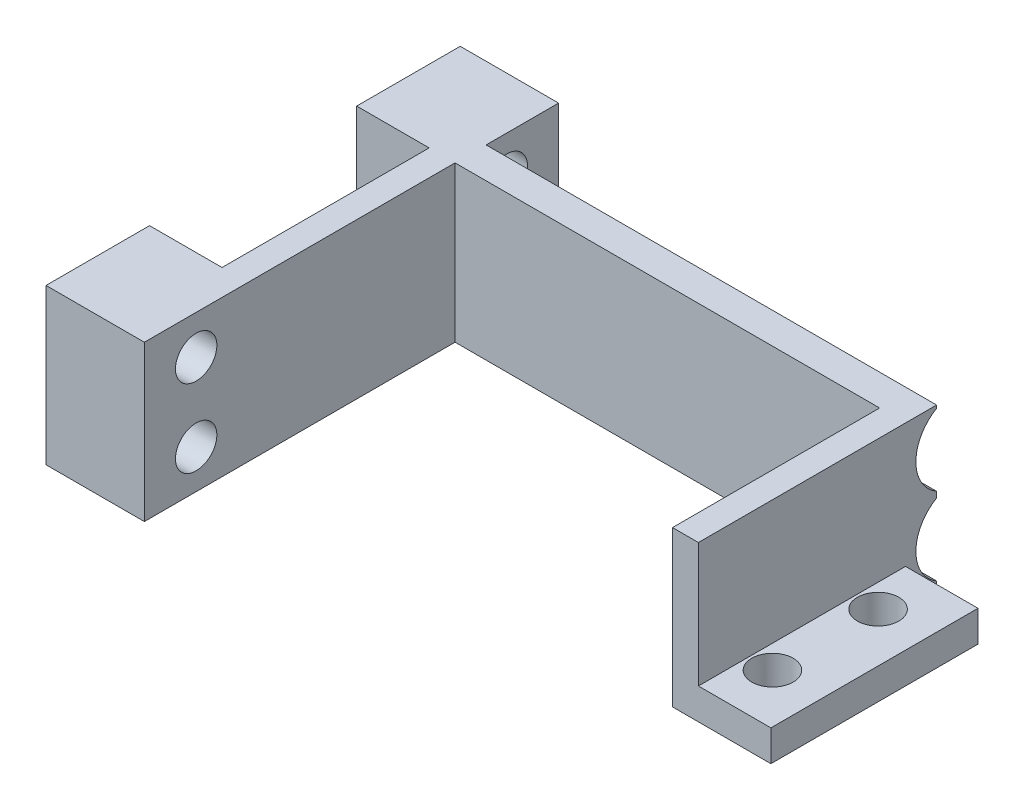
ISO-10303-21;
HEADER;
FILE_DESCRIPTION(('STEP AP214'),'2;1');
FILE_NAME('part.step','',(''),(''),'','','');
FILE_SCHEMA(('AUTOMOTIVE_DESIGN { 1 0 10303 214 1 1 1 1 }'));
ENDSEC;
DATA;
#1=APPLICATION_CONTEXT('core data for automotive mechanical design processes');
#2=APPLICATION_PROTOCOL_DEFINITION('international standard','automotive_design',2000,#1);
#3=PRODUCT_CONTEXT('',#1,'mechanical');
#4=PRODUCT('Part','Part','',(#3));
#5=PRODUCT_RELATED_PRODUCT_CATEGORY('part','',(#4));
#6=PRODUCT_DEFINITION_FORMATION('','',#4);
#7=PRODUCT_DEFINITION_CONTEXT('part definition',#1,'design');
#8=PRODUCT_DEFINITION('design','',#6,#7);
#9=PRODUCT_DEFINITION_SHAPE('','',#8);
#10=(LENGTH_UNIT() NAMED_UNIT(*) SI_UNIT(.MILLI.,.METRE.));
#11=(NAMED_UNIT(*) PLANE_ANGLE_UNIT() SI_UNIT($,.RADIAN.));
#12=(NAMED_UNIT(*) SI_UNIT($,.STERADIAN.) SOLID_ANGLE_UNIT());
#13=UNCERTAINTY_MEASURE_WITH_UNIT(LENGTH_MEASURE(1.E-05),#10,'distance_accuracy_value','');
#14=(GEOMETRIC_REPRESENTATION_CONTEXT(3) GLOBAL_UNCERTAINTY_ASSIGNED_CONTEXT((#13)) GLOBAL_UNIT_ASSIGNED_CONTEXT((#10,
#11,#12)) REPRESENTATION_CONTEXT('',''));
#15=CARTESIAN_POINT('',(0.,0.,0.));
#16=DIRECTION('',(0.,0.,1.));
#17=DIRECTION('',(1.,0.,0.));
#18=AXIS2_PLACEMENT_3D('',#15,#16,#17);
#19=CARTESIAN_POINT('',(0.,-20.,0.));
#20=DIRECTION('',(0.,0.,-1.));
#21=DIRECTION('',(-1.,0.,0.));
#22=AXIS2_PLACEMENT_3D('',#19,#20,#21);
#23=PLANE('',#22);
#24=DIRECTION('',(0.,1.,0.));
#25=VECTOR('',#24,1.);
#26=CARTESIAN_POINT('',(2.5,-20.,0.));
#27=LINE('',#26,#25);
#28=CARTESIAN_POINT('',(2.5,-27.7858983848622,0.));
#29=VERTEX_POINT('',#28);
#30=CARTESIAN_POINT('',(2.5,-27.2141016151378,0.));
#31=VERTEX_POINT('',#30);
#32=EDGE_CURVE('E48',#29,#31,#27,.T.);
#33=ORIENTED_EDGE('',*,*,#32,.T.);
#34=DIRECTION('',(-1.,0.,0.));
#35=VECTOR('',#34,1.);
#36=CARTESIAN_POINT('',(53.001,-27.2141016151378,0.));
#37=LINE('',#36,#35);
#38=CARTESIAN_POINT('',(46.,-27.2141016151378,0.));
#39=VERTEX_POINT('',#38);
#40=EDGE_CURVE('E192',#39,#31,#37,.T.);
#41=ORIENTED_EDGE('',*,*,#40,.F.);
#42=DIRECTION('',(0.,-1.,0.));
#43=VECTOR('',#42,1.);
#44=CARTESIAN_POINT('',(46.,-20.,0.));
#45=LINE('',#44,#43);
#46=CARTESIAN_POINT('',(46.,-27.7858983848622,0.));
#47=VERTEX_POINT('',#46);
#48=EDGE_CURVE('E372',#39,#47,#45,.T.);
#49=ORIENTED_EDGE('',*,*,#48,.T.);
#50=DIRECTION('',(-1.,0.,0.));
#51=VECTOR('',#50,1.);
#52=CARTESIAN_POINT('',(53.001,-27.7858983848622,0.));
#53=LINE('',#52,#51);
#54=EDGE_CURVE('E442',#29,#47,#53,.F.);
#55=ORIENTED_EDGE('',*,*,#54,.F.);
#56=EDGE_LOOP('',(#33,#41,#49,#55));
#57=FACE_BOUND('',#56,.T.);
#58=ADVANCED_FACE('F39',(#57),#23,.T.);
#59=CARTESIAN_POINT('',(46.,-20.,0.));
#60=VERTEX_POINT('',#59);
#61=CARTESIAN_POINT('',(46.,-20.2858983848622,0.));
#62=VERTEX_POINT('',#61);
#63=EDGE_CURVE('E204',#60,#62,#45,.T.);
#64=ORIENTED_EDGE('',*,*,#63,.T.);
#65=DIRECTION('',(-1.,0.,0.));
#66=VECTOR('',#65,1.);
#67=CARTESIAN_POINT('',(53.001,-20.2858983848622,0.));
#68=LINE('',#67,#66);
#69=CARTESIAN_POINT('',(2.5,-20.2858983848622,0.));
#70=VERTEX_POINT('',#69);
#71=EDGE_CURVE('E189',#70,#62,#68,.F.);
#72=ORIENTED_EDGE('',*,*,#71,.F.);
#73=CARTESIAN_POINT('',(2.5,-20.,0.));
#74=VERTEX_POINT('',#73);
#75=EDGE_CURVE('E50',#70,#74,#27,.T.);
#76=ORIENTED_EDGE('',*,*,#75,.T.);
#77=DIRECTION('',(1.,0.,0.));
#78=VECTOR('',#77,1.);
#79=CARTESIAN_POINT('',(0.,-20.,0.));
#80=LINE('',#79,#78);
#81=EDGE_CURVE('E360',#74,#60,#80,.T.);
#82=ORIENTED_EDGE('',*,*,#81,.T.);
#83=EDGE_LOOP('',(#64,#72,#76,#82));
#84=FACE_BOUND('',#83,.T.);
#85=ADVANCED_FACE('F201',(#84),#23,.T.);
#86=CARTESIAN_POINT('',(2.5,-35.,0.));
#87=VERTEX_POINT('',#86);
#88=CARTESIAN_POINT('',(2.5,-34.7141016151377,0.));
#89=VERTEX_POINT('',#88);
#90=EDGE_CURVE('E11',#87,#89,#27,.T.);
#91=ORIENTED_EDGE('',*,*,#90,.T.);
#92=DIRECTION('',(-1.,0.,0.));
#93=VECTOR('',#92,1.);
#94=CARTESIAN_POINT('',(53.001,-34.7141016151377,0.));
#95=LINE('',#94,#93);
#96=CARTESIAN_POINT('',(46.,-34.7141016151377,0.));
#97=VERTEX_POINT('',#96);
#98=EDGE_CURVE('E205',#97,#89,#95,.T.);
#99=ORIENTED_EDGE('',*,*,#98,.F.);
#100=CARTESIAN_POINT('',(46.,-35.,0.));
#101=VERTEX_POINT('',#100);
#102=EDGE_CURVE('E370',#97,#101,#45,.T.);
#103=ORIENTED_EDGE('',*,*,#102,.T.);
#104=DIRECTION('',(-1.,0.,0.));
#105=VECTOR('',#104,1.);
#106=CARTESIAN_POINT('',(0.,-35.,0.));
#107=LINE('',#106,#105);
#108=EDGE_CURVE('E365',#101,#87,#107,.T.);
#109=ORIENTED_EDGE('',*,*,#108,.T.);
#110=EDGE_LOOP('',(#91,#99,#103,#109));
#111=FACE_BOUND('',#110,.T.);
#112=ADVANCED_FACE('F434',(#111),#23,.T.);
#113=CARTESIAN_POINT('',(0.,-20.,3.));
#114=DIRECTION('',(1.,0.,0.));
#115=DIRECTION('',(0.,0.,-1.));
#116=AXIS2_PLACEMENT_3D('',#113,#114,#115);
#117=PLANE('',#116);
#118=DIRECTION('',(0.,0.,1.));
#119=VECTOR('',#118,1.);
#120=CARTESIAN_POINT('',(0.,-32.,23.));
#121=LINE('',#120,#119);
#122=CARTESIAN_POINT('',(0.,-32.,3.));
#123=VERTEX_POINT('',#122);
#124=CARTESIAN_POINT('',(0.,-32.,23.));
#125=VERTEX_POINT('',#124);
#126=EDGE_CURVE('E340',#123,#125,#121,.T.);
#127=ORIENTED_EDGE('',*,*,#126,.T.);
#128=DIRECTION('',(0.,1.,0.));
#129=VECTOR('',#128,1.);
#130=CARTESIAN_POINT('',(0.,-20.,23.));
#131=LINE('',#130,#129);
#132=CARTESIAN_POINT('',(0.,-20.,23.));
#133=VERTEX_POINT('',#132);
#134=EDGE_CURVE('E351',#125,#133,#131,.T.);
#135=ORIENTED_EDGE('',*,*,#134,.T.);
#136=DIRECTION('',(0.,0.,-1.));
#137=VECTOR('',#136,1.);
#138=CARTESIAN_POINT('',(0.,-20.,3.));
#139=LINE('',#138,#137);
#140=CARTESIAN_POINT('',(0.,-20.,3.));
#141=VERTEX_POINT('',#140);
#142=EDGE_CURVE('E211',#133,#141,#139,.T.);
#143=ORIENTED_EDGE('',*,*,#142,.T.);
#144=DIRECTION('',(0.,1.,0.));
#145=VECTOR('',#144,1.);
#146=CARTESIAN_POINT('',(0.,-20.,3.));
#147=LINE('',#146,#145);
#148=EDGE_CURVE('E256',#123,#141,#147,.T.);
#149=ORIENTED_EDGE('',*,*,#148,.F.);
#150=EDGE_LOOP('',(#127,#135,#143,#149));
#151=FACE_BOUND('',#150,.T.);
#152=ADVANCED_FACE('F41',(#151),#117,.F.);
#153=CARTESIAN_POINT('',(0.,-20.,3.));
#154=DIRECTION('',(0.,0.,-1.));
#155=DIRECTION('',(-1.,0.,0.));
#156=AXIS2_PLACEMENT_3D('',#153,#154,#155);
#157=PLANE('',#156);
#158=DIRECTION('',(1.,0.,0.));
#159=VECTOR('',#158,1.);
#160=CARTESIAN_POINT('',(0.,-20.,3.));
#161=LINE('',#160,#159);
#162=CARTESIAN_POINT('',(2.5,-20.,3.));
#163=VERTEX_POINT('',#162);
#164=CARTESIAN_POINT('',(43.5,-20.,3.));
#165=VERTEX_POINT('',#164);
#166=EDGE_CURVE('E361',#163,#165,#161,.T.);
#167=ORIENTED_EDGE('',*,*,#166,.F.);
#168=DIRECTION('',(0.,-1.,0.));
#169=VECTOR('',#168,1.);
#170=CARTESIAN_POINT('',(2.5,-20.,3.));
#171=LINE('',#170,#169);
#172=CARTESIAN_POINT('',(2.5,-35.,3.));
#173=VERTEX_POINT('',#172);
#174=EDGE_CURVE('E350',#163,#173,#171,.T.);
#175=ORIENTED_EDGE('',*,*,#174,.T.);
#176=DIRECTION('',(-1.,0.,0.));
#177=VECTOR('',#176,1.);
#178=CARTESIAN_POINT('',(0.,-35.,3.));
#179=LINE('',#178,#177);
#180=CARTESIAN_POINT('',(43.5,-35.,3.));
#181=VERTEX_POINT('',#180);
#182=EDGE_CURVE('E364',#181,#173,#179,.T.);
#183=ORIENTED_EDGE('',*,*,#182,.F.);
#184=DIRECTION('',(0.,-1.,0.));
#185=VECTOR('',#184,1.);
#186=CARTESIAN_POINT('',(43.5,-20.,3.));
#187=LINE('',#186,#185);
#188=EDGE_CURVE('E314',#165,#181,#187,.T.);
#189=ORIENTED_EDGE('',*,*,#188,.F.);
#190=EDGE_LOOP('',(#167,#175,#183,#189));
#191=FACE_BOUND('',#190,.T.);
#192=ADVANCED_FACE('F415',(#191),#157,.F.);
#193=CARTESIAN_POINT('',(0.,-20.,3.));
#194=DIRECTION('',(0.,-1.,0.));
#195=DIRECTION('',(0.,0.,1.));
#196=AXIS2_PLACEMENT_3D('',#193,#194,#195);
#197=PLANE('',#196);
#198=ORIENTED_EDGE('',*,*,#142,.F.);
#199=DIRECTION('',(1.,0.,0.));
#200=VECTOR('',#199,1.);
#201=CARTESIAN_POINT('',(2.5,-20.,23.));
#202=LINE('',#201,#200);
#203=CARTESIAN_POINT('',(-7.00000000000001,-20.,23.));
#204=VERTEX_POINT('',#203);
#205=EDGE_CURVE('E275',#204,#133,#202,.T.);
#206=ORIENTED_EDGE('',*,*,#205,.F.);
#207=DIRECTION('',(0.,0.,-1.));
#208=VECTOR('',#207,1.);
#209=CARTESIAN_POINT('',(-7.00000000000001,-20.,33.));
#210=LINE('',#209,#208);
#211=CARTESIAN_POINT('',(-7.00000000000001,-20.,33.));
#212=VERTEX_POINT('',#211);
#213=EDGE_CURVE('E283',#212,#204,#210,.T.);
#214=ORIENTED_EDGE('',*,*,#213,.F.);
#215=DIRECTION('',(1.,0.,0.));
#216=VECTOR('',#215,1.);
#217=CARTESIAN_POINT('',(2.5,-20.,33.));
#218=LINE('',#217,#216);
#219=CARTESIAN_POINT('',(2.5,-20.,33.));
#220=VERTEX_POINT('',#219);
#221=EDGE_CURVE('E280',#212,#220,#218,.T.);
#222=ORIENTED_EDGE('',*,*,#221,.T.);
#223=DIRECTION('',(0.,0.,-1.));
#224=VECTOR('',#223,1.);
#225=CARTESIAN_POINT('',(2.5,-20.,23.));
#226=LINE('',#225,#224);
#227=EDGE_CURVE('E358',#220,#163,#226,.T.);
#228=ORIENTED_EDGE('',*,*,#227,.T.);
#229=ORIENTED_EDGE('',*,*,#166,.T.);
#230=DIRECTION('',(0.,0.,-1.));
#231=VECTOR('',#230,1.);
#232=CARTESIAN_POINT('',(43.5,-20.,23.));
#233=LINE('',#232,#231);
#234=CARTESIAN_POINT('',(43.5,-20.,23.));
#235=VERTEX_POINT('',#234);
#236=EDGE_CURVE('E65',#235,#165,#233,.T.);
#237=ORIENTED_EDGE('',*,*,#236,.F.);
#238=DIRECTION('',(-1.,0.,0.));
#239=VECTOR('',#238,1.);
#240=CARTESIAN_POINT('',(46.,-20.,23.));
#241=LINE('',#240,#239);
#242=CARTESIAN_POINT('',(46.,-20.,23.));
#243=VERTEX_POINT('',#242);
#244=EDGE_CURVE('E322',#243,#235,#241,.T.);
#245=ORIENTED_EDGE('',*,*,#244,.F.);
#246=DIRECTION('',(0.,0.,-1.));
#247=VECTOR('',#246,1.);
#248=CARTESIAN_POINT('',(46.,-20.,3.));
#249=LINE('',#248,#247);
#250=EDGE_CURVE('E213',#243,#60,#249,.T.);
#251=ORIENTED_EDGE('',*,*,#250,.T.);
#252=ORIENTED_EDGE('',*,*,#81,.F.);
#253=DIRECTION('',(0.,0.,1.));
#254=VECTOR('',#253,1.);
#255=CARTESIAN_POINT('',(2.5,-20.,-7.));
#256=LINE('',#255,#254);
#257=CARTESIAN_POINT('',(2.5,-20.,-7.));
#258=VERTEX_POINT('',#257);
#259=EDGE_CURVE('E209',#258,#74,#256,.T.);
#260=ORIENTED_EDGE('',*,*,#259,.F.);
#261=DIRECTION('',(1.,0.,0.));
#262=VECTOR('',#261,1.);
#263=CARTESIAN_POINT('',(2.5,-20.,-7.));
#264=LINE('',#263,#262);
#265=CARTESIAN_POINT('',(-7.00000000000001,-20.,-7.));
#266=VERTEX_POINT('',#265);
#267=EDGE_CURVE('E238',#266,#258,#264,.T.);
#268=ORIENTED_EDGE('',*,*,#267,.F.);
#269=DIRECTION('',(0.,0.,1.));
#270=VECTOR('',#269,1.);
#271=CARTESIAN_POINT('',(-7.00000000000001,-20.,-7.));
#272=LINE('',#271,#270);
#273=CARTESIAN_POINT('',(-7.00000000000001,-20.,3.));
#274=VERTEX_POINT('',#273);
#275=EDGE_CURVE('E252',#266,#274,#272,.T.);
#276=ORIENTED_EDGE('',*,*,#275,.T.);
#277=DIRECTION('',(1.,0.,0.));
#278=VECTOR('',#277,1.);
#279=CARTESIAN_POINT('',(2.5,-20.,3.));
#280=LINE('',#279,#278);
#281=EDGE_CURVE('E224',#274,#141,#280,.T.);
#282=ORIENTED_EDGE('',*,*,#281,.T.);
#283=EDGE_LOOP('',(#198,#206,#214,#222,#228,#229,#237,#245,#251,#252,#260,#268,#276,#282));
#284=FACE_BOUND('',#283,.T.);
#285=ADVANCED_FACE('F410',(#284),#197,.F.);
#286=CARTESIAN_POINT('',(46.,-20.,3.));
#287=DIRECTION('',(-1.,0.,0.));
#288=DIRECTION('',(0.,0.,1.));
#289=AXIS2_PLACEMENT_3D('',#286,#287,#288);
#290=PLANE('',#289);
#291=CARTESIAN_POINT('',(46.,-23.75,-2.));
#292=DIRECTION('',(-1.,0.,0.));
#293=DIRECTION('',(0.,0.,1.));
#294=AXIS2_PLACEMENT_3D('',#291,#292,#293);
#295=CIRCLE('',#294,4.);
#296=EDGE_CURVE('E197',#39,#62,#295,.T.);
#297=ORIENTED_EDGE('',*,*,#296,.T.);
#298=ORIENTED_EDGE('',*,*,#63,.F.);
#299=ORIENTED_EDGE('',*,*,#250,.F.);
#300=DIRECTION('',(0.,1.,0.));
#301=VECTOR('',#300,1.);
#302=CARTESIAN_POINT('',(46.,-20.,23.));
#303=LINE('',#302,#301);
#304=CARTESIAN_POINT('',(46.,-32.,23.));
#305=VERTEX_POINT('',#304);
#306=EDGE_CURVE('E315',#305,#243,#303,.T.);
#307=ORIENTED_EDGE('',*,*,#306,.F.);
#308=DIRECTION('',(0.,0.,1.));
#309=VECTOR('',#308,1.);
#310=CARTESIAN_POINT('',(46.,-32.,23.));
#311=LINE('',#310,#309);
#312=CARTESIAN_POINT('',(46.,-32.,3.));
#313=VERTEX_POINT('',#312);
#314=EDGE_CURVE('E306',#313,#305,#311,.T.);
#315=ORIENTED_EDGE('',*,*,#314,.F.);
#316=DIRECTION('',(0.,1.,0.));
#317=VECTOR('',#316,1.);
#318=CARTESIAN_POINT('',(46.,-35.,3.));
#319=LINE('',#318,#317);
#320=CARTESIAN_POINT('',(46.,-35.,3.));
#321=VERTEX_POINT('',#320);
#322=EDGE_CURVE('E298',#321,#313,#319,.T.);
#323=ORIENTED_EDGE('',*,*,#322,.F.);
#324=DIRECTION('',(0.,0.,-1.));
#325=VECTOR('',#324,1.);
#326=CARTESIAN_POINT('',(46.,-35.,3.));
#327=LINE('',#326,#325);
#328=EDGE_CURVE('E368',#321,#101,#327,.T.);
#329=ORIENTED_EDGE('',*,*,#328,.T.);
#330=ORIENTED_EDGE('',*,*,#102,.F.);
#331=CARTESIAN_POINT('',(46.,-31.25,-2.));
#332=DIRECTION('',(-1.,0.,0.));
#333=DIRECTION('',(0.,0.,1.));
#334=AXIS2_PLACEMENT_3D('',#331,#332,#333);
#335=CIRCLE('',#334,4.);
#336=EDGE_CURVE('E443',#97,#47,#335,.T.);
#337=ORIENTED_EDGE('',*,*,#336,.T.);
#338=ORIENTED_EDGE('',*,*,#48,.F.);
#339=EDGE_LOOP('',(#297,#298,#299,#307,#315,#323,#329,#330,#337,#338));
#340=FACE_BOUND('',#339,.T.);
#341=ADVANCED_FACE('F405',(#340),#290,.F.);
#342=CARTESIAN_POINT('',(0.,-35.,3.));
#343=DIRECTION('',(0.,1.,0.));
#344=DIRECTION('',(0.,0.,-1.));
#345=AXIS2_PLACEMENT_3D('',#342,#343,#344);
#346=PLANE('',#345);
#347=CARTESIAN_POINT('',(-2.25,-35.,18.1));
#348=DIRECTION('',(0.,1.,0.));
#349=DIRECTION('',(0.,0.,1.));
#350=AXIS2_PLACEMENT_3D('',#347,#348,#349);
#351=CIRCLE('',#350,2.);
#352=CARTESIAN_POINT('',(-2.25,-35.,20.1));
#353=VERTEX_POINT('',#352);
#354=EDGE_CURVE('E330',#353,#353,#351,.T.);
#355=ORIENTED_EDGE('',*,*,#354,.T.);
#356=EDGE_LOOP('',(#355));
#357=FACE_BOUND('',#356,.T.);
#358=CARTESIAN_POINT('',(-2.25,-35.,7.9));
#359=DIRECTION('',(0.,1.,0.));
#360=DIRECTION('',(0.,0.,-1.));
#361=AXIS2_PLACEMENT_3D('',#358,#359,#360);
#362=CIRCLE('',#361,2.);
#363=CARTESIAN_POINT('',(-2.25,-35.,5.9));
#364=VERTEX_POINT('',#363);
#365=EDGE_CURVE('E329',#364,#364,#362,.T.);
#366=ORIENTED_EDGE('',*,*,#365,.T.);
#367=EDGE_LOOP('',(#366));
#368=FACE_BOUND('',#367,.T.);
#369=DIRECTION('',(0.,0.,-1.));
#370=VECTOR('',#369,1.);
#371=CARTESIAN_POINT('',(2.5,-35.,23.));
#372=LINE('',#371,#370);
#373=CARTESIAN_POINT('',(2.5,-35.,33.));
#374=VERTEX_POINT('',#373);
#375=EDGE_CURVE('E354',#374,#173,#372,.T.);
#376=ORIENTED_EDGE('',*,*,#375,.F.);
#377=DIRECTION('',(-1.,0.,0.));
#378=VECTOR('',#377,1.);
#379=CARTESIAN_POINT('',(2.5,-35.,33.));
#380=LINE('',#379,#378);
#381=CARTESIAN_POINT('',(-7.00000000000001,-35.,33.));
#382=VERTEX_POINT('',#381);
#383=EDGE_CURVE('E274',#374,#382,#380,.T.);
#384=ORIENTED_EDGE('',*,*,#383,.T.);
#385=DIRECTION('',(0.,0.,-1.));
#386=VECTOR('',#385,1.);
#387=CARTESIAN_POINT('',(-7.,-35.,23.));
#388=LINE('',#387,#386);
#389=CARTESIAN_POINT('',(-7.00000000000001,-35.,-7.));
#390=VERTEX_POINT('',#389);
#391=EDGE_CURVE('E336',#382,#390,#388,.T.);
#392=ORIENTED_EDGE('',*,*,#391,.T.);
#393=DIRECTION('',(-1.,0.,0.));
#394=VECTOR('',#393,1.);
#395=CARTESIAN_POINT('',(2.5,-35.,-7.));
#396=LINE('',#395,#394);
#397=CARTESIAN_POINT('',(2.5,-35.,-7.));
#398=VERTEX_POINT('',#397);
#399=EDGE_CURVE('E244',#398,#390,#396,.T.);
#400=ORIENTED_EDGE('',*,*,#399,.F.);
#401=DIRECTION('',(0.,0.,1.));
#402=VECTOR('',#401,1.);
#403=CARTESIAN_POINT('',(2.5,-35.,-7.));
#404=LINE('',#403,#402);
#405=EDGE_CURVE('E247',#398,#87,#404,.T.);
#406=ORIENTED_EDGE('',*,*,#405,.T.);
#407=ORIENTED_EDGE('',*,*,#108,.F.);
#408=ORIENTED_EDGE('',*,*,#328,.F.);
#409=DIRECTION('',(-1.,0.,0.));
#410=VECTOR('',#409,1.);
#411=CARTESIAN_POINT('',(53.,-35.,3.));
#412=LINE('',#411,#410);
#413=CARTESIAN_POINT('',(53.,-35.,3.));
#414=VERTEX_POINT('',#413);
#415=EDGE_CURVE('E305',#414,#321,#412,.T.);
#416=ORIENTED_EDGE('',*,*,#415,.F.);
#417=DIRECTION('',(0.,0.,-1.));
#418=VECTOR('',#417,1.);
#419=CARTESIAN_POINT('',(53.,-35.,23.));
#420=LINE('',#419,#418);
#421=CARTESIAN_POINT('',(53.,-35.,23.));
#422=VERTEX_POINT('',#421);
#423=EDGE_CURVE('E302',#422,#414,#420,.T.);
#424=ORIENTED_EDGE('',*,*,#423,.F.);
#425=DIRECTION('',(1.,0.,0.));
#426=VECTOR('',#425,1.);
#427=CARTESIAN_POINT('',(46.,-35.,23.));
#428=LINE('',#427,#426);
#429=CARTESIAN_POINT('',(43.5,-35.,23.));
#430=VERTEX_POINT('',#429);
#431=EDGE_CURVE('E317',#430,#422,#428,.T.);
#432=ORIENTED_EDGE('',*,*,#431,.F.);
#433=DIRECTION('',(0.,0.,-1.));
#434=VECTOR('',#433,1.);
#435=CARTESIAN_POINT('',(43.5,-35.,23.));
#436=LINE('',#435,#434);
#437=EDGE_CURVE('E327',#430,#181,#436,.T.);
#438=ORIENTED_EDGE('',*,*,#437,.T.);
#439=ORIENTED_EDGE('',*,*,#182,.T.);
#440=EDGE_LOOP('',(#376,#384,#392,#400,#406,#407,#408,#416,#424,#432,#438,#439));
#441=FACE_BOUND('',#440,.T.);
#442=CARTESIAN_POINT('',(48.25,-35.,7.9));
#443=DIRECTION('',(0.,-1.,0.));
#444=DIRECTION('',(0.,0.,-1.));
#445=AXIS2_PLACEMENT_3D('',#442,#443,#444);
#446=CIRCLE('',#445,2.);
#447=CARTESIAN_POINT('',(48.25,-35.,5.9));
#448=VERTEX_POINT('',#447);
#449=EDGE_CURVE('E288',#448,#448,#446,.T.);
#450=ORIENTED_EDGE('',*,*,#449,.F.);
#451=EDGE_LOOP('',(#450));
#452=FACE_BOUND('',#451,.T.);
#453=CARTESIAN_POINT('',(48.25,-35.,18.1));
#454=DIRECTION('',(0.,-1.,0.));
#455=DIRECTION('',(0.,0.,1.));
#456=AXIS2_PLACEMENT_3D('',#453,#454,#455);
#457=CIRCLE('',#456,2.);
#458=CARTESIAN_POINT('',(48.25,-35.,20.1));
#459=VERTEX_POINT('',#458);
#460=EDGE_CURVE('E289',#459,#459,#457,.T.);
#461=ORIENTED_EDGE('',*,*,#460,.F.);
#462=EDGE_LOOP('',(#461));
#463=FACE_BOUND('',#462,.T.);
#464=ADVANCED_FACE('F422',(#357,#368,#441,#452,#463),#346,.F.);
#465=CARTESIAN_POINT('',(2.5,-20.,23.));
#466=DIRECTION('',(-1.,0.,0.));
#467=DIRECTION('',(0.,0.,1.));
#468=AXIS2_PLACEMENT_3D('',#465,#466,#467);
#469=PLANE('',#468);
#470=CARTESIAN_POINT('',(2.5,-31.25,28.));
#471=DIRECTION('',(1.,0.,0.));
#472=DIRECTION('',(0.,0.,1.));
#473=AXIS2_PLACEMENT_3D('',#470,#471,#472);
#474=CIRCLE('',#473,2.);
#475=CARTESIAN_POINT('',(2.5,-31.25,30.));
#476=VERTEX_POINT('',#475);
#477=EDGE_CURVE('E268',#476,#476,#474,.T.);
#478=ORIENTED_EDGE('',*,*,#477,.F.);
#479=EDGE_LOOP('',(#478));
#480=FACE_BOUND('',#479,.T.);
#481=CARTESIAN_POINT('',(2.5,-23.75,28.));
#482=DIRECTION('',(1.,0.,0.));
#483=DIRECTION('',(0.,0.,1.));
#484=AXIS2_PLACEMENT_3D('',#481,#482,#483);
#485=CIRCLE('',#484,2.);
#486=CARTESIAN_POINT('',(2.5,-23.75,30.));
#487=VERTEX_POINT('',#486);
#488=EDGE_CURVE('E263',#487,#487,#485,.T.);
#489=ORIENTED_EDGE('',*,*,#488,.F.);
#490=EDGE_LOOP('',(#489));
#491=FACE_BOUND('',#490,.T.);
#492=ORIENTED_EDGE('',*,*,#174,.F.);
#493=ORIENTED_EDGE('',*,*,#227,.F.);
#494=DIRECTION('',(0.,-1.,0.));
#495=VECTOR('',#494,1.);
#496=CARTESIAN_POINT('',(2.5,-35.,33.));
#497=LINE('',#496,#495);
#498=EDGE_CURVE('E272',#220,#374,#497,.T.);
#499=ORIENTED_EDGE('',*,*,#498,.T.);
#500=ORIENTED_EDGE('',*,*,#375,.T.);
#501=EDGE_LOOP('',(#492,#493,#499,#500));
#502=FACE_BOUND('',#501,.T.);
#503=ADVANCED_FACE('F476',(#480,#491,#502),#469,.F.);
#504=CARTESIAN_POINT('',(-7.,-32.,23.));
#505=DIRECTION('',(0.,-1.,0.));
#506=DIRECTION('',(0.,0.,1.));
#507=AXIS2_PLACEMENT_3D('',#504,#505,#506);
#508=PLANE('',#507);
#509=CARTESIAN_POINT('',(-2.25,-32.,18.1));
#510=DIRECTION('',(0.,1.,0.));
#511=DIRECTION('',(0.,0.,1.));
#512=AXIS2_PLACEMENT_3D('',#509,#510,#511);
#513=CIRCLE('',#512,2.);
#514=CARTESIAN_POINT('',(-2.25,-32.,20.1));
#515=VERTEX_POINT('',#514);
#516=EDGE_CURVE('E346',#515,#515,#513,.T.);
#517=ORIENTED_EDGE('',*,*,#516,.F.);
#518=EDGE_LOOP('',(#517));
#519=FACE_BOUND('',#518,.T.);
#520=CARTESIAN_POINT('',(-2.25,-32.,7.9));
#521=DIRECTION('',(0.,1.,0.));
#522=DIRECTION('',(0.,0.,1.));
#523=AXIS2_PLACEMENT_3D('',#520,#521,#522);
#524=CIRCLE('',#523,2.);
#525=CARTESIAN_POINT('',(-2.25,-32.,9.9));
#526=VERTEX_POINT('',#525);
#527=EDGE_CURVE('E333',#526,#526,#524,.T.);
#528=ORIENTED_EDGE('',*,*,#527,.F.);
#529=EDGE_LOOP('',(#528));
#530=FACE_BOUND('',#529,.T.);
#531=ORIENTED_EDGE('',*,*,#126,.F.);
#532=DIRECTION('',(1.,0.,0.));
#533=VECTOR('',#532,1.);
#534=CARTESIAN_POINT('',(-7.,-32.,3.));
#535=LINE('',#534,#533);
#536=CARTESIAN_POINT('',(-7.,-32.,3.));
#537=VERTEX_POINT('',#536);
#538=EDGE_CURVE('E348',#537,#123,#535,.T.);
#539=ORIENTED_EDGE('',*,*,#538,.F.);
#540=DIRECTION('',(0.,0.,1.));
#541=VECTOR('',#540,1.);
#542=CARTESIAN_POINT('',(-7.,-32.,23.));
#543=LINE('',#542,#541);
#544=CARTESIAN_POINT('',(-7.00000000000001,-32.,23.));
#545=VERTEX_POINT('',#544);
#546=EDGE_CURVE('E339',#537,#545,#543,.T.);
#547=ORIENTED_EDGE('',*,*,#546,.T.);
#548=DIRECTION('',(1.,0.,0.));
#549=VECTOR('',#548,1.);
#550=CARTESIAN_POINT('',(-7.,-32.,23.));
#551=LINE('',#550,#549);
#552=EDGE_CURVE('E343',#545,#125,#551,.T.);
#553=ORIENTED_EDGE('',*,*,#552,.T.);
#554=EDGE_LOOP('',(#531,#539,#547,#553));
#555=FACE_BOUND('',#554,.T.);
#556=ADVANCED_FACE('F478',(#519,#530,#555),#508,.F.);
#557=CARTESIAN_POINT('',(-7.,-20.,0.));
#558=DIRECTION('',(1.,0.,0.));
#559=DIRECTION('',(0.,0.,-1.));
#560=AXIS2_PLACEMENT_3D('',#557,#558,#559);
#561=PLANE('',#560);
#562=CARTESIAN_POINT('',(-7.,-31.25,-2.));
#563=DIRECTION('',(-1.,0.,0.));
#564=DIRECTION('',(0.,0.,-1.));
#565=AXIS2_PLACEMENT_3D('',#562,#563,#564);
#566=CIRCLE('',#565,2.);
#567=CARTESIAN_POINT('',(-7.,-31.25,-4.));
#568=VERTEX_POINT('',#567);
#569=EDGE_CURVE('E220',#568,#568,#566,.T.);
#570=ORIENTED_EDGE('',*,*,#569,.F.);
#571=EDGE_LOOP('',(#570));
#572=FACE_BOUND('',#571,.T.);
#573=CARTESIAN_POINT('',(-7.,-23.75,-2.));
#574=DIRECTION('',(-1.,0.,0.));
#575=DIRECTION('',(0.,0.,1.));
#576=AXIS2_PLACEMENT_3D('',#573,#574,#575);
#577=CIRCLE('',#576,2.);
#578=CARTESIAN_POINT('',(-7.,-23.75,0.));
#579=VERTEX_POINT('',#578);
#580=EDGE_CURVE('E226',#579,#579,#577,.T.);
#581=ORIENTED_EDGE('',*,*,#580,.F.);
#582=EDGE_LOOP('',(#581));
#583=FACE_BOUND('',#582,.T.);
#584=CARTESIAN_POINT('',(-7.,-31.25,28.));
#585=DIRECTION('',(1.,0.,0.));
#586=DIRECTION('',(0.,0.,1.));
#587=AXIS2_PLACEMENT_3D('',#584,#585,#586);
#588=CIRCLE('',#587,2.);
#589=CARTESIAN_POINT('',(-7.,-31.25,30.));
#590=VERTEX_POINT('',#589);
#591=EDGE_CURVE('E260',#590,#590,#588,.T.);
#592=ORIENTED_EDGE('',*,*,#591,.T.);
#593=EDGE_LOOP('',(#592));
#594=FACE_BOUND('',#593,.T.);
#595=CARTESIAN_POINT('',(-7.,-23.75,28.));
#596=DIRECTION('',(1.,0.,0.));
#597=DIRECTION('',(0.,0.,-1.));
#598=AXIS2_PLACEMENT_3D('',#595,#596,#597);
#599=CIRCLE('',#598,2.);
#600=CARTESIAN_POINT('',(-7.,-23.75,26.));
#601=VERTEX_POINT('',#600);
#602=EDGE_CURVE('E259',#601,#601,#599,.T.);
#603=ORIENTED_EDGE('',*,*,#602,.T.);
#604=EDGE_LOOP('',(#603));
#605=FACE_BOUND('',#604,.T.);
#606=ORIENTED_EDGE('',*,*,#546,.F.);
#607=DIRECTION('',(0.,1.,0.));
#608=VECTOR('',#607,1.);
#609=CARTESIAN_POINT('',(-7.00000000000001,-35.,3.));
#610=LINE('',#609,#608);
#611=EDGE_CURVE('E239',#537,#274,#610,.T.);
#612=ORIENTED_EDGE('',*,*,#611,.T.);
#613=ORIENTED_EDGE('',*,*,#275,.F.);
#614=DIRECTION('',(0.,1.,0.));
#615=VECTOR('',#614,1.);
#616=CARTESIAN_POINT('',(-7.00000000000001,-35.,-7.));
#617=LINE('',#616,#615);
#618=EDGE_CURVE('E242',#390,#266,#617,.T.);
#619=ORIENTED_EDGE('',*,*,#618,.F.);
#620=ORIENTED_EDGE('',*,*,#391,.F.);
#621=DIRECTION('',(0.,1.,0.));
#622=VECTOR('',#621,1.);
#623=CARTESIAN_POINT('',(-7.00000000000001,-35.,33.));
#624=LINE('',#623,#622);
#625=EDGE_CURVE('E278',#382,#212,#624,.T.);
#626=ORIENTED_EDGE('',*,*,#625,.T.);
#627=ORIENTED_EDGE('',*,*,#213,.T.);
#628=DIRECTION('',(0.,1.,0.));
#629=VECTOR('',#628,1.);
#630=CARTESIAN_POINT('',(-7.00000000000001,-35.,23.));
#631=LINE('',#630,#629);
#632=EDGE_CURVE('E271',#545,#204,#631,.T.);
#633=ORIENTED_EDGE('',*,*,#632,.F.);
#634=EDGE_LOOP('',(#606,#612,#613,#619,#620,#626,#627,#633));
#635=FACE_BOUND('',#634,.T.);
#636=ADVANCED_FACE('F458',(#572,#583,#594,#605,#635),#561,.F.);
#637=CARTESIAN_POINT('',(-2.25,-28.,7.9));
#638=DIRECTION('',(0.,-1.,0.));
#639=DIRECTION('',(0.,0.,1.));
#640=AXIS2_PLACEMENT_3D('',#637,#638,#639);
#641=CYLINDRICAL_SURFACE('',#640,2.);
#642=ORIENTED_EDGE('',*,*,#365,.F.);
#643=EDGE_LOOP('',(#642));
#644=FACE_BOUND('',#643,.T.);
#645=ORIENTED_EDGE('',*,*,#527,.T.);
#646=EDGE_LOOP('',(#645));
#647=FACE_BOUND('',#646,.T.);
#648=ADVANCED_FACE('F626',(#644,#647),#641,.F.);
#649=CARTESIAN_POINT('',(-2.25,-28.,18.1));
#650=DIRECTION('',(0.,-1.,0.));
#651=DIRECTION('',(0.,0.,1.));
#652=AXIS2_PLACEMENT_3D('',#649,#650,#651);
#653=CYLINDRICAL_SURFACE('',#652,2.);
#654=ORIENTED_EDGE('',*,*,#354,.F.);
#655=EDGE_LOOP('',(#654));
#656=FACE_BOUND('',#655,.T.);
#657=ORIENTED_EDGE('',*,*,#516,.T.);
#658=EDGE_LOOP('',(#657));
#659=FACE_BOUND('',#658,.T.);
#660=ADVANCED_FACE('F636',(#656,#659),#653,.F.);
#661=CARTESIAN_POINT('',(43.5,-20.,23.));
#662=DIRECTION('',(-1.,0.,0.));
#663=DIRECTION('',(0.,0.,1.));
#664=AXIS2_PLACEMENT_3D('',#661,#662,#663);
#665=PLANE('',#664);
#666=ORIENTED_EDGE('',*,*,#188,.T.);
#667=ORIENTED_EDGE('',*,*,#437,.F.);
#668=DIRECTION('',(0.,-1.,0.));
#669=VECTOR('',#668,1.);
#670=CARTESIAN_POINT('',(43.5,-20.,23.));
#671=LINE('',#670,#669);
#672=EDGE_CURVE('E320',#235,#430,#671,.T.);
#673=ORIENTED_EDGE('',*,*,#672,.F.);
#674=ORIENTED_EDGE('',*,*,#236,.T.);
#675=EDGE_LOOP('',(#666,#667,#673,#674));
#676=FACE_BOUND('',#675,.T.);
#677=ADVANCED_FACE('F417',(#676),#665,.T.);
#678=CARTESIAN_POINT('',(46.,-20.,23.));
#679=DIRECTION('',(0.,0.,-1.));
#680=DIRECTION('',(1.,0.,0.));
#681=AXIS2_PLACEMENT_3D('',#678,#679,#680);
#682=PLANE('',#681);
#683=ORIENTED_EDGE('',*,*,#306,.T.);
#684=ORIENTED_EDGE('',*,*,#244,.T.);
#685=ORIENTED_EDGE('',*,*,#672,.T.);
#686=ORIENTED_EDGE('',*,*,#431,.T.);
#687=DIRECTION('',(0.,-1.,0.));
#688=VECTOR('',#687,1.);
#689=CARTESIAN_POINT('',(53.,-35.,23.));
#690=LINE('',#689,#688);
#691=CARTESIAN_POINT('',(53.,-32.,23.));
#692=VERTEX_POINT('',#691);
#693=EDGE_CURVE('E295',#692,#422,#690,.T.);
#694=ORIENTED_EDGE('',*,*,#693,.F.);
#695=DIRECTION('',(-1.,0.,0.));
#696=VECTOR('',#695,1.);
#697=CARTESIAN_POINT('',(53.,-32.,23.));
#698=LINE('',#697,#696);
#699=EDGE_CURVE('E57',#692,#305,#698,.T.);
#700=ORIENTED_EDGE('',*,*,#699,.T.);
#701=EDGE_LOOP('',(#683,#684,#685,#686,#694,#700));
#702=FACE_BOUND('',#701,.T.);
#703=ADVANCED_FACE('F395',(#702),#682,.F.);
#704=CARTESIAN_POINT('',(53.,-32.,23.));
#705=DIRECTION('',(0.,1.,0.));
#706=DIRECTION('',(0.,0.,-1.));
#707=AXIS2_PLACEMENT_3D('',#704,#705,#706);
#708=PLANE('',#707);
#709=CARTESIAN_POINT('',(48.25,-32.,18.1));
#710=DIRECTION('',(0.,-1.,0.));
#711=DIRECTION('',(0.,0.,-1.));
#712=AXIS2_PLACEMENT_3D('',#709,#710,#711);
#713=CIRCLE('',#712,2.);
#714=CARTESIAN_POINT('',(48.25,-32.,16.1));
#715=VERTEX_POINT('',#714);
#716=EDGE_CURVE('E216',#715,#715,#713,.F.);
#717=ORIENTED_EDGE('',*,*,#716,.F.);
#718=EDGE_LOOP('',(#717));
#719=FACE_BOUND('',#718,.T.);
#720=CARTESIAN_POINT('',(48.25,-32.,7.9));
#721=DIRECTION('',(0.,-1.,0.));
#722=DIRECTION('',(0.,0.,-1.));
#723=AXIS2_PLACEMENT_3D('',#720,#721,#722);
#724=CIRCLE('',#723,2.);
#725=CARTESIAN_POINT('',(48.25,-32.,5.9));
#726=VERTEX_POINT('',#725);
#727=EDGE_CURVE('E292',#726,#726,#724,.F.);
#728=ORIENTED_EDGE('',*,*,#727,.F.);
#729=EDGE_LOOP('',(#728));
#730=FACE_BOUND('',#729,.T.);
#731=ORIENTED_EDGE('',*,*,#314,.T.);
#732=ORIENTED_EDGE('',*,*,#699,.F.);
#733=DIRECTION('',(0.,0.,1.));
#734=VECTOR('',#733,1.);
#735=CARTESIAN_POINT('',(53.,-32.,23.));
#736=LINE('',#735,#734);
#737=CARTESIAN_POINT('',(53.,-32.,3.));
#738=VERTEX_POINT('',#737);
#739=EDGE_CURVE('E297',#738,#692,#736,.T.);
#740=ORIENTED_EDGE('',*,*,#739,.F.);
#741=DIRECTION('',(-1.,0.,0.));
#742=VECTOR('',#741,1.);
#743=CARTESIAN_POINT('',(53.,-32.,3.));
#744=LINE('',#743,#742);
#745=EDGE_CURVE('E311',#738,#313,#744,.T.);
#746=ORIENTED_EDGE('',*,*,#745,.T.);
#747=EDGE_LOOP('',(#731,#732,#740,#746));
#748=FACE_BOUND('',#747,.T.);
#749=ADVANCED_FACE('F391',(#719,#730,#748),#708,.T.);
#750=CARTESIAN_POINT('',(53.,-35.,3.));
#751=DIRECTION('',(0.,0.,-1.));
#752=DIRECTION('',(-1.,0.,0.));
#753=AXIS2_PLACEMENT_3D('',#750,#751,#752);
#754=PLANE('',#753);
#755=ORIENTED_EDGE('',*,*,#322,.T.);
#756=ORIENTED_EDGE('',*,*,#745,.F.);
#757=DIRECTION('',(0.,1.,0.));
#758=VECTOR('',#757,1.);
#759=CARTESIAN_POINT('',(53.,-35.,3.));
#760=LINE('',#759,#758);
#761=EDGE_CURVE('E300',#414,#738,#760,.T.);
#762=ORIENTED_EDGE('',*,*,#761,.F.);
#763=ORIENTED_EDGE('',*,*,#415,.T.);
#764=EDGE_LOOP('',(#755,#756,#762,#763));
#765=FACE_BOUND('',#764,.T.);
#766=ADVANCED_FACE('F394',(#765),#754,.T.);
#767=CARTESIAN_POINT('',(53.,-20.,0.));
#768=DIRECTION('',(-1.,0.,0.));
#769=DIRECTION('',(0.,0.,-1.));
#770=AXIS2_PLACEMENT_3D('',#767,#768,#769);
#771=PLANE('',#770);
#772=ORIENTED_EDGE('',*,*,#693,.T.);
#773=ORIENTED_EDGE('',*,*,#423,.T.);
#774=ORIENTED_EDGE('',*,*,#761,.T.);
#775=ORIENTED_EDGE('',*,*,#739,.T.);
#776=EDGE_LOOP('',(#772,#773,#774,#775));
#777=FACE_BOUND('',#776,.T.);
#778=ADVANCED_FACE('F426',(#777),#771,.F.);
#779=CARTESIAN_POINT('',(48.25,-28.,7.9));
#780=DIRECTION('',(0.,-1.,0.));
#781=DIRECTION('',(0.,0.,1.));
#782=AXIS2_PLACEMENT_3D('',#779,#780,#781);
#783=CYLINDRICAL_SURFACE('',#782,2.);
#784=ORIENTED_EDGE('',*,*,#727,.T.);
#785=EDGE_LOOP('',(#784));
#786=FACE_BOUND('',#785,.T.);
#787=ORIENTED_EDGE('',*,*,#449,.T.);
#788=EDGE_LOOP('',(#787));
#789=FACE_BOUND('',#788,.T.);
#790=ADVANCED_FACE('F681',(#786,#789),#783,.F.);
#791=CARTESIAN_POINT('',(48.25,-28.,18.1));
#792=DIRECTION('',(0.,-1.,0.));
#793=DIRECTION('',(0.,0.,1.));
#794=AXIS2_PLACEMENT_3D('',#791,#792,#793);
#795=CYLINDRICAL_SURFACE('',#794,2.);
#796=ORIENTED_EDGE('',*,*,#716,.T.);
#797=EDGE_LOOP('',(#796));
#798=FACE_BOUND('',#797,.T.);
#799=ORIENTED_EDGE('',*,*,#460,.T.);
#800=EDGE_LOOP('',(#799));
#801=FACE_BOUND('',#800,.T.);
#802=ADVANCED_FACE('F388',(#798,#801),#795,.F.);
#803=CARTESIAN_POINT('',(0.,-20.,23.));
#804=DIRECTION('',(0.,0.,-1.));
#805=DIRECTION('',(-1.,0.,0.));
#806=AXIS2_PLACEMENT_3D('',#803,#804,#805);
#807=PLANE('',#806);
#808=ORIENTED_EDGE('',*,*,#134,.F.);
#809=ORIENTED_EDGE('',*,*,#552,.F.);
#810=ORIENTED_EDGE('',*,*,#632,.T.);
#811=ORIENTED_EDGE('',*,*,#205,.T.);
#812=EDGE_LOOP('',(#808,#809,#810,#811));
#813=FACE_BOUND('',#812,.T.);
#814=ADVANCED_FACE('F469',(#813),#807,.T.);
#815=CARTESIAN_POINT('',(0.,-20.,33.));
#816=DIRECTION('',(0.,0.,-1.));
#817=DIRECTION('',(-1.,0.,0.));
#818=AXIS2_PLACEMENT_3D('',#815,#816,#817);
#819=PLANE('',#818);
#820=ORIENTED_EDGE('',*,*,#498,.F.);
#821=ORIENTED_EDGE('',*,*,#221,.F.);
#822=ORIENTED_EDGE('',*,*,#625,.F.);
#823=ORIENTED_EDGE('',*,*,#383,.F.);
#824=EDGE_LOOP('',(#820,#821,#822,#823));
#825=FACE_BOUND('',#824,.T.);
#826=ADVANCED_FACE('F474',(#825),#819,.F.);
#827=CARTESIAN_POINT('',(3.,-23.75,28.));
#828=DIRECTION('',(-1.,0.,0.));
#829=DIRECTION('',(0.,0.,1.));
#830=AXIS2_PLACEMENT_3D('',#827,#828,#829);
#831=CYLINDRICAL_SURFACE('',#830,2.);
#832=ORIENTED_EDGE('',*,*,#602,.F.);
#833=EDGE_LOOP('',(#832));
#834=FACE_BOUND('',#833,.T.);
#835=ORIENTED_EDGE('',*,*,#488,.T.);
#836=EDGE_LOOP('',(#835));
#837=FACE_BOUND('',#836,.T.);
#838=ADVANCED_FACE('F590',(#834,#837),#831,.F.);
#839=CARTESIAN_POINT('',(3.,-31.25,28.));
#840=DIRECTION('',(-1.,0.,0.));
#841=DIRECTION('',(0.,0.,1.));
#842=AXIS2_PLACEMENT_3D('',#839,#840,#841);
#843=CYLINDRICAL_SURFACE('',#842,2.);
#844=ORIENTED_EDGE('',*,*,#591,.F.);
#845=EDGE_LOOP('',(#844));
#846=FACE_BOUND('',#845,.T.);
#847=ORIENTED_EDGE('',*,*,#477,.T.);
#848=EDGE_LOOP('',(#847));
#849=FACE_BOUND('',#848,.T.);
#850=ADVANCED_FACE('F582',(#846,#849),#843,.F.);
#851=CARTESIAN_POINT('',(0.,-20.,3.));
#852=DIRECTION('',(0.,0.,1.));
#853=DIRECTION('',(-1.,0.,0.));
#854=AXIS2_PLACEMENT_3D('',#851,#852,#853);
#855=PLANE('',#854);
#856=ORIENTED_EDGE('',*,*,#148,.T.);
#857=ORIENTED_EDGE('',*,*,#281,.F.);
#858=ORIENTED_EDGE('',*,*,#611,.F.);
#859=ORIENTED_EDGE('',*,*,#538,.T.);
#860=EDGE_LOOP('',(#856,#857,#858,#859));
#861=FACE_BOUND('',#860,.T.);
#862=ADVANCED_FACE('F461',(#861),#855,.T.);
#863=CARTESIAN_POINT('',(2.5,-35.,-7.));
#864=DIRECTION('',(1.,0.,0.));
#865=DIRECTION('',(0.,0.,-1.));
#866=AXIS2_PLACEMENT_3D('',#863,#864,#865);
#867=PLANE('',#866);
#868=CARTESIAN_POINT('',(2.5,-23.75,-2.));
#869=DIRECTION('',(-1.,0.,0.));
#870=DIRECTION('',(0.,0.,-1.));
#871=AXIS2_PLACEMENT_3D('',#868,#869,#870);
#872=CIRCLE('',#871,2.);
#873=CARTESIAN_POINT('',(2.5,-23.75,-4.));
#874=VERTEX_POINT('',#873);
#875=EDGE_CURVE('E218',#874,#874,#872,.F.);
#876=ORIENTED_EDGE('',*,*,#875,.F.);
#877=EDGE_LOOP('',(#876));
#878=FACE_BOUND('',#877,.T.);
#879=CARTESIAN_POINT('',(2.5,-31.25,-2.));
#880=DIRECTION('',(-1.,0.,0.));
#881=DIRECTION('',(0.,0.,-1.));
#882=AXIS2_PLACEMENT_3D('',#879,#880,#881);
#883=CIRCLE('',#882,2.);
#884=CARTESIAN_POINT('',(2.5,-31.25,-4.));
#885=VERTEX_POINT('',#884);
#886=EDGE_CURVE('E43',#885,#885,#883,.F.);
#887=ORIENTED_EDGE('',*,*,#886,.F.);
#888=EDGE_LOOP('',(#887));
#889=FACE_BOUND('',#888,.T.);
#890=ORIENTED_EDGE('',*,*,#90,.F.);
#891=ORIENTED_EDGE('',*,*,#405,.F.);
#892=DIRECTION('',(0.,-1.,0.));
#893=VECTOR('',#892,1.);
#894=CARTESIAN_POINT('',(2.5,-35.,-7.));
#895=LINE('',#894,#893);
#896=EDGE_CURVE('E236',#258,#398,#895,.T.);
#897=ORIENTED_EDGE('',*,*,#896,.F.);
#898=ORIENTED_EDGE('',*,*,#259,.T.);
#899=ORIENTED_EDGE('',*,*,#75,.F.);
#900=CARTESIAN_POINT('',(2.5,-23.75,-2.));
#901=DIRECTION('',(1.,0.,0.));
#902=DIRECTION('',(0.,0.,-1.));
#903=AXIS2_PLACEMENT_3D('',#900,#901,#902);
#904=CIRCLE('',#903,4.);
#905=EDGE_CURVE('E186',#70,#31,#904,.T.);
#906=ORIENTED_EDGE('',*,*,#905,.T.);
#907=ORIENTED_EDGE('',*,*,#32,.F.);
#908=CARTESIAN_POINT('',(2.5,-31.25,-2.));
#909=DIRECTION('',(1.,0.,0.));
#910=DIRECTION('',(0.,0.,-1.));
#911=AXIS2_PLACEMENT_3D('',#908,#909,#910);
#912=CIRCLE('',#911,4.);
#913=EDGE_CURVE('E233',#29,#89,#912,.T.);
#914=ORIENTED_EDGE('',*,*,#913,.T.);
#915=EDGE_LOOP('',(#890,#891,#897,#898,#899,#906,#907,#914));
#916=FACE_BOUND('',#915,.T.);
#917=ADVANCED_FACE('F207',(#878,#889,#916),#867,.T.);
#918=CARTESIAN_POINT('',(0.,-20.,-7.));
#919=DIRECTION('',(0.,0.,1.));
#920=DIRECTION('',(-1.,0.,0.));
#921=AXIS2_PLACEMENT_3D('',#918,#919,#920);
#922=PLANE('',#921);
#923=ORIENTED_EDGE('',*,*,#896,.T.);
#924=ORIENTED_EDGE('',*,*,#399,.T.);
#925=ORIENTED_EDGE('',*,*,#618,.T.);
#926=ORIENTED_EDGE('',*,*,#267,.T.);
#927=EDGE_LOOP('',(#923,#924,#925,#926));
#928=FACE_BOUND('',#927,.T.);
#929=ADVANCED_FACE('F452',(#928),#922,.F.);
#930=CARTESIAN_POINT('',(3.,-23.75,-2.));
#931=DIRECTION('',(-1.,0.,0.));
#932=DIRECTION('',(0.,0.,1.));
#933=AXIS2_PLACEMENT_3D('',#930,#931,#932);
#934=CYLINDRICAL_SURFACE('',#933,2.);
#935=ORIENTED_EDGE('',*,*,#875,.T.);
#936=EDGE_LOOP('',(#935));
#937=FACE_BOUND('',#936,.T.);
#938=ORIENTED_EDGE('',*,*,#580,.T.);
#939=EDGE_LOOP('',(#938));
#940=FACE_BOUND('',#939,.T.);
#941=ADVANCED_FACE('F528',(#937,#940),#934,.F.);
#942=CARTESIAN_POINT('',(3.,-31.25,-2.));
#943=DIRECTION('',(-1.,0.,0.));
#944=DIRECTION('',(0.,0.,1.));
#945=AXIS2_PLACEMENT_3D('',#942,#943,#944);
#946=CYLINDRICAL_SURFACE('',#945,2.);
#947=ORIENTED_EDGE('',*,*,#886,.T.);
#948=EDGE_LOOP('',(#947));
#949=FACE_BOUND('',#948,.T.);
#950=ORIENTED_EDGE('',*,*,#569,.T.);
#951=EDGE_LOOP('',(#950));
#952=FACE_BOUND('',#951,.T.);
#953=ADVANCED_FACE('F532',(#949,#952),#946,.F.);
#954=CARTESIAN_POINT('',(53.001,-31.25,-2.));
#955=DIRECTION('',(-1.,0.,0.));
#956=DIRECTION('',(0.,0.,1.));
#957=AXIS2_PLACEMENT_3D('',#954,#955,#956);
#958=CYLINDRICAL_SURFACE('',#957,4.);
#959=ORIENTED_EDGE('',*,*,#98,.T.);
#960=ORIENTED_EDGE('',*,*,#913,.F.);
#961=ORIENTED_EDGE('',*,*,#54,.T.);
#962=ORIENTED_EDGE('',*,*,#336,.F.);
#963=EDGE_LOOP('',(#959,#960,#961,#962));
#964=FACE_BOUND('',#963,.T.);
#965=ADVANCED_FACE('F449',(#964),#958,.F.);
#966=CARTESIAN_POINT('',(53.001,-23.75,-2.));
#967=DIRECTION('',(-1.,0.,0.));
#968=DIRECTION('',(0.,0.,1.));
#969=AXIS2_PLACEMENT_3D('',#966,#967,#968);
#970=CYLINDRICAL_SURFACE('',#969,4.);
#971=ORIENTED_EDGE('',*,*,#40,.T.);
#972=ORIENTED_EDGE('',*,*,#905,.F.);
#973=ORIENTED_EDGE('',*,*,#71,.T.);
#974=ORIENTED_EDGE('',*,*,#296,.F.);
#975=EDGE_LOOP('',(#971,#972,#973,#974));
#976=FACE_BOUND('',#975,.T.);
#977=ADVANCED_FACE('F188',(#976),#970,.F.);
#978=CLOSED_SHELL('',(#58,#85,#112,#152,#192,#285,#341,#464,#503,#556,#636,#648,#660,#677,#703,
#749,#766,#778,#790,#802,#814,#826,#838,#850,#862,#917,#929,#941,#953,#965,#977));
#979=MANIFOLD_SOLID_BREP('B2',#978);
#980=ADVANCED_BREP_SHAPE_REPRESENTATION('',(#18,#979),#14);
#981=SHAPE_DEFINITION_REPRESENTATION(#9,#980);
ENDSEC;
END-ISO-10303-21;
